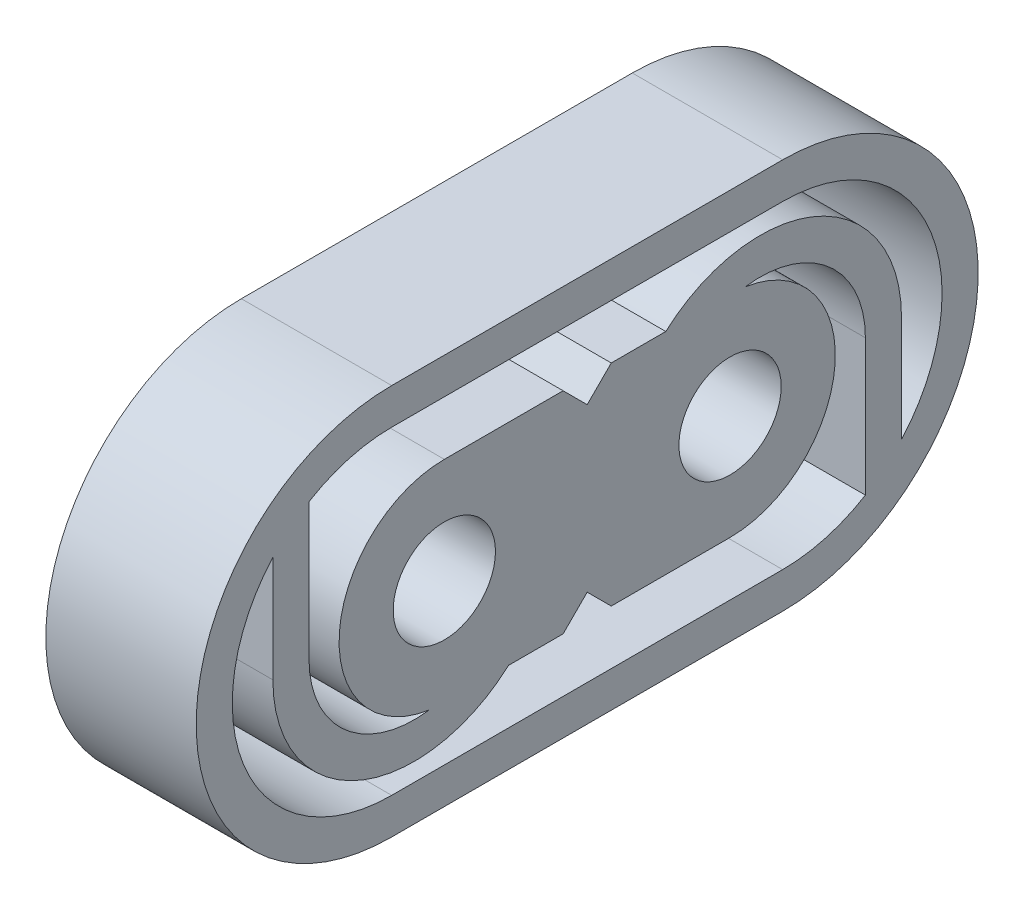
ISO-10303-21;
HEADER;
FILE_DESCRIPTION(('STEP AP214'),'2;1');
FILE_NAME('part.step','',(''),(''),'','','');
FILE_SCHEMA(('AUTOMOTIVE_DESIGN { 1 0 10303 214 1 1 1 1 }'));
ENDSEC;
DATA;
#1=APPLICATION_CONTEXT('core data for automotive mechanical design processes');
#2=APPLICATION_PROTOCOL_DEFINITION('international standard','automotive_design',2000,#1);
#3=PRODUCT_CONTEXT('',#1,'mechanical');
#4=PRODUCT('Part','Part','',(#3));
#5=PRODUCT_RELATED_PRODUCT_CATEGORY('part','',(#4));
#6=PRODUCT_DEFINITION_FORMATION('','',#4);
#7=PRODUCT_DEFINITION_CONTEXT('part definition',#1,'design');
#8=PRODUCT_DEFINITION('design','',#6,#7);
#9=PRODUCT_DEFINITION_SHAPE('','',#8);
#10=(LENGTH_UNIT() NAMED_UNIT(*) SI_UNIT(.MILLI.,.METRE.));
#11=(NAMED_UNIT(*) PLANE_ANGLE_UNIT() SI_UNIT($,.RADIAN.));
#12=(NAMED_UNIT(*) SI_UNIT($,.STERADIAN.) SOLID_ANGLE_UNIT());
#13=UNCERTAINTY_MEASURE_WITH_UNIT(LENGTH_MEASURE(1.E-05),#10,'distance_accuracy_value','');
#14=(GEOMETRIC_REPRESENTATION_CONTEXT(3) GLOBAL_UNCERTAINTY_ASSIGNED_CONTEXT((#13)) GLOBAL_UNIT_ASSIGNED_CONTEXT((#10,
#11,#12)) REPRESENTATION_CONTEXT('',''));
#15=CARTESIAN_POINT('',(0.,0.,0.));
#16=DIRECTION('',(0.,0.,1.));
#17=DIRECTION('',(1.,0.,0.));
#18=AXIS2_PLACEMENT_3D('',#15,#16,#17);
#19=CARTESIAN_POINT('',(5.,0.0278549064895704,6.49624326478912));
#20=DIRECTION('',(1.,0.,0.));
#21=DIRECTION('',(0.,0.,-1.));
#22=AXIS2_PLACEMENT_3D('',#19,#20,#21);
#23=PLANE('',#22);
#24=CARTESIAN_POINT('',(5.,0.0278549064895708,4.74624326478912));
#25=DIRECTION('',(1.,0.,0.));
#26=DIRECTION('',(0.,0.,-1.));
#27=AXIS2_PLACEMENT_3D('',#24,#25,#26);
#28=CIRCLE('',#27,1.7);
#29=CARTESIAN_POINT('',(5.,0.0278549064895708,3.04624326478912));
#30=VERTEX_POINT('',#29);
#31=EDGE_CURVE('E272',#30,#30,#28,.T.);
#32=ORIENTED_EDGE('',*,*,#31,.F.);
#33=EDGE_LOOP('',(#32));
#34=FACE_BOUND('',#33,.T.);
#35=CARTESIAN_POINT('',(5.,0.0278549064895704,6.49624326478912));
#36=DIRECTION('',(1.,0.,0.));
#37=DIRECTION('',(0.,0.,-1.));
#38=AXIS2_PLACEMENT_3D('',#35,#36,#37);
#39=CIRCLE('',#38,6.5);
#40=CARTESIAN_POINT('',(5.,6.52785490648957,6.49624326478912));
#41=VERTEX_POINT('',#40);
#42=CARTESIAN_POINT('',(5.,-6.47214509351043,6.49624326478912));
#43=VERTEX_POINT('',#42);
#44=EDGE_CURVE('E414',#41,#43,#39,.T.);
#45=ORIENTED_EDGE('',*,*,#44,.T.);
#46=DIRECTION('',(0.,0.,-1.));
#47=VECTOR('',#46,1.);
#48=CARTESIAN_POINT('',(5.,-6.47214509351043,6.49624326478912));
#49=LINE('',#48,#47);
#50=CARTESIAN_POINT('',(5.,-6.47214509351043,-6.50375673521088));
#51=VERTEX_POINT('',#50);
#52=EDGE_CURVE('E413',#43,#51,#49,.T.);
#53=ORIENTED_EDGE('',*,*,#52,.T.);
#54=CARTESIAN_POINT('',(5.,0.0278549064895723,-6.50375673521088));
#55=DIRECTION('',(1.,0.,0.));
#56=DIRECTION('',(0.,0.,-1.));
#57=AXIS2_PLACEMENT_3D('',#54,#55,#56);
#58=CIRCLE('',#57,6.5);
#59=CARTESIAN_POINT('',(5.,6.52785490648957,-6.50375673521088));
#60=VERTEX_POINT('',#59);
#61=EDGE_CURVE('E416',#51,#60,#58,.T.);
#62=ORIENTED_EDGE('',*,*,#61,.T.);
#63=DIRECTION('',(0.,0.,1.));
#64=VECTOR('',#63,1.);
#65=CARTESIAN_POINT('',(5.,6.52785490648957,6.49624326478912));
#66=LINE('',#65,#64);
#67=EDGE_CURVE('E419',#60,#41,#66,.T.);
#68=ORIENTED_EDGE('',*,*,#67,.T.);
#69=EDGE_LOOP('',(#45,#53,#62,#68));
#70=FACE_BOUND('',#69,.T.);
#71=DIRECTION('',(0.,0.,-1.));
#72=VECTOR('',#71,1.);
#73=CARTESIAN_POINT('',(5.,-5.27214509351043,6.49624326478912));
#74=LINE('',#73,#72);
#75=CARTESIAN_POINT('',(5.,-5.27214509351043,6.49624326478912));
#76=VERTEX_POINT('',#75);
#77=CARTESIAN_POINT('',(5.,-5.27214509351043,-6.50375673521091));
#78=VERTEX_POINT('',#77);
#79=EDGE_CURVE('E330',#76,#78,#74,.T.);
#80=ORIENTED_EDGE('',*,*,#79,.F.);
#81=CARTESIAN_POINT('',(5.,0.02785490648957,6.49624326478912));
#82=DIRECTION('',(1.,0.,0.));
#83=DIRECTION('',(0.,0.,-1.));
#84=AXIS2_PLACEMENT_3D('',#81,#82,#83);
#85=CIRCLE('',#84,5.3);
#86=CARTESIAN_POINT('',(5.,3.5616206033065,10.4462432647891));
#87=VERTEX_POINT('',#86);
#88=EDGE_CURVE('E324',#87,#76,#85,.T.);
#89=ORIENTED_EDGE('',*,*,#88,.F.);
#90=DIRECTION('',(0.,1.,0.));
#91=VECTOR('',#90,1.);
#92=CARTESIAN_POINT('',(5.,0.0278549064895708,10.4462432647891));
#93=LINE('',#92,#91);
#94=CARTESIAN_POINT('',(5.,0.0278549064895714,10.4462432647891));
#95=VERTEX_POINT('',#94);
#96=EDGE_CURVE('E349',#95,#87,#93,.T.);
#97=ORIENTED_EDGE('',*,*,#96,.F.);
#98=CARTESIAN_POINT('',(5.,0.0278549064895708,5.74624326478912));
#99=DIRECTION('',(-1.,0.,0.));
#100=DIRECTION('',(0.,0.,-1.));
#101=AXIS2_PLACEMENT_3D('',#98,#99,#100);
#102=CIRCLE('',#101,4.7);
#103=CARTESIAN_POINT('',(5.,-3.47214509351043,2.6093658365175));
#104=VERTEX_POINT('',#103);
#105=EDGE_CURVE('E347',#104,#95,#102,.T.);
#106=ORIENTED_EDGE('',*,*,#105,.F.);
#107=DIRECTION('',(0.,0.,1.));
#108=VECTOR('',#107,1.);
#109=CARTESIAN_POINT('',(5.,-3.47214509351043,2.6093658365175));
#110=LINE('',#109,#108);
#111=CARTESIAN_POINT('',(5.,-3.47214509351043,0.796243264789123));
#112=VERTEX_POINT('',#111);
#113=EDGE_CURVE('E341',#112,#104,#110,.T.);
#114=ORIENTED_EDGE('',*,*,#113,.F.);
#115=DIRECTION('',(0.,-0.707106781186547,0.707106781186548));
#116=VECTOR('',#115,1.);
#117=CARTESIAN_POINT('',(5.,-3.47214509351043,0.796243264789123));
#118=LINE('',#117,#116);
#119=CARTESIAN_POINT('',(5.,-2.67214509351043,-0.00375673521087715));
#120=VERTEX_POINT('',#119);
#121=EDGE_CURVE('E344',#120,#112,#118,.T.);
#122=ORIENTED_EDGE('',*,*,#121,.F.);
#123=DIRECTION('',(0.,0.707106781186548,0.707106781186547));
#124=VECTOR('',#123,1.);
#125=CARTESIAN_POINT('',(5.,-2.67214509351043,-0.00375673521087715));
#126=LINE('',#125,#124);
#127=CARTESIAN_POINT('',(5.,-3.47214509351043,-0.803756735210877));
#128=VERTEX_POINT('',#127);
#129=EDGE_CURVE('E339',#128,#120,#126,.T.);
#130=ORIENTED_EDGE('',*,*,#129,.F.);
#131=DIRECTION('',(0.,0.,1.));
#132=VECTOR('',#131,1.);
#133=CARTESIAN_POINT('',(5.,-3.47214509351043,-0.803756735210877));
#134=LINE('',#133,#132);
#135=CARTESIAN_POINT('',(5.,-3.47214509351043,-4.7537567352109));
#136=VERTEX_POINT('',#135);
#137=EDGE_CURVE('E337',#136,#128,#134,.T.);
#138=ORIENTED_EDGE('',*,*,#137,.F.);
#139=CARTESIAN_POINT('',(5.,0.0278549064895708,-4.75375673521088));
#140=DIRECTION('',(-1.,0.,0.));
#141=DIRECTION('',(0.,0.,-1.));
#142=AXIS2_PLACEMENT_3D('',#139,#140,#141);
#143=CIRCLE('',#142,3.5);
#144=CARTESIAN_POINT('',(5.,3.49195652162733,-5.25375673521088));
#145=VERTEX_POINT('',#144);
#146=EDGE_CURVE('E336',#145,#136,#143,.T.);
#147=ORIENTED_EDGE('',*,*,#146,.F.);
#148=CARTESIAN_POINT('',(5.,0.0278549064895708,-5.75375673521088));
#149=DIRECTION('',(1.,0.,0.));
#150=DIRECTION('',(0.,0.,-1.));
#151=AXIS2_PLACEMENT_3D('',#148,#149,#150);
#152=CIRCLE('',#151,3.5);
#153=CARTESIAN_POINT('',(5.,0.0278549064895708,-9.25375673521088));
#154=VERTEX_POINT('',#153);
#155=EDGE_CURVE('E331',#154,#145,#152,.T.);
#156=ORIENTED_EDGE('',*,*,#155,.F.);
#157=DIRECTION('',(0.,1.,0.));
#158=VECTOR('',#157,1.);
#159=CARTESIAN_POINT('',(5.,-4.50287351176726,-9.25375673521088));
#160=LINE('',#159,#158);
#161=CARTESIAN_POINT('',(5.,-4.50287351176726,-9.25375673521087));
#162=VERTEX_POINT('',#161);
#163=EDGE_CURVE('E335',#162,#154,#160,.T.);
#164=ORIENTED_EDGE('',*,*,#163,.F.);
#165=CARTESIAN_POINT('',(5.,0.0278549064895723,-6.50375673521088));
#166=DIRECTION('',(1.,0.,0.));
#167=DIRECTION('',(0.,0.,-1.));
#168=AXIS2_PLACEMENT_3D('',#165,#166,#167);
#169=CIRCLE('',#168,5.3);
#170=EDGE_CURVE('E329',#78,#162,#169,.T.);
#171=ORIENTED_EDGE('',*,*,#170,.F.);
#172=EDGE_LOOP('',(#80,#89,#97,#106,#114,#122,#130,#138,#147,#156,#164,#171));
#173=FACE_BOUND('',#172,.T.);
#174=DIRECTION('',(0.,-1.,0.));
#175=VECTOR('',#174,1.);
#176=CARTESIAN_POINT('',(5.,4.5585833247464,9.24624326478912));
#177=LINE('',#176,#175);
#178=CARTESIAN_POINT('',(5.,4.5585833247464,9.24624326478912));
#179=VERTEX_POINT('',#178);
#180=CARTESIAN_POINT('',(5.,0.0278549064895586,9.24624326478912));
#181=VERTEX_POINT('',#180);
#182=EDGE_CURVE('E233',#179,#181,#177,.T.);
#183=ORIENTED_EDGE('',*,*,#182,.F.);
#184=CARTESIAN_POINT('',(5.,0.02785490648957,6.49624326478912));
#185=DIRECTION('',(1.,0.,0.));
#186=DIRECTION('',(0.,0.,-1.));
#187=AXIS2_PLACEMENT_3D('',#184,#185,#186);
#188=CIRCLE('',#187,5.3);
#189=CARTESIAN_POINT('',(5.,5.32785490648957,6.49624326478912));
#190=VERTEX_POINT('',#189);
#191=EDGE_CURVE('E230',#190,#179,#188,.T.);
#192=ORIENTED_EDGE('',*,*,#191,.F.);
#193=DIRECTION('',(0.,0.,1.));
#194=VECTOR('',#193,1.);
#195=CARTESIAN_POINT('',(5.,5.32785490648957,6.49624326478912));
#196=LINE('',#195,#194);
#197=CARTESIAN_POINT('',(5.,5.32785490648957,-6.50375673521088));
#198=VERTEX_POINT('',#197);
#199=EDGE_CURVE('E269',#198,#190,#196,.T.);
#200=ORIENTED_EDGE('',*,*,#199,.F.);
#201=CARTESIAN_POINT('',(5.,0.0278549064895723,-6.50375673521088));
#202=DIRECTION('',(1.,0.,0.));
#203=DIRECTION('',(0.,0.,-1.));
#204=AXIS2_PLACEMENT_3D('',#201,#202,#203);
#205=CIRCLE('',#204,5.3);
#206=CARTESIAN_POINT('',(5.,-3.50591079032736,-10.4537567352109));
#207=VERTEX_POINT('',#206);
#208=EDGE_CURVE('E268',#207,#198,#205,.T.);
#209=ORIENTED_EDGE('',*,*,#208,.F.);
#210=DIRECTION('',(0.,-1.,0.));
#211=VECTOR('',#210,1.);
#212=CARTESIAN_POINT('',(5.,-3.50591079032736,-10.4537567352109));
#213=LINE('',#212,#211);
#214=CARTESIAN_POINT('',(5.,0.0278549064895708,-10.4537567352109));
#215=VERTEX_POINT('',#214);
#216=EDGE_CURVE('E266',#215,#207,#213,.T.);
#217=ORIENTED_EDGE('',*,*,#216,.F.);
#218=CARTESIAN_POINT('',(5.,0.0278549064895708,-5.75375673521088));
#219=DIRECTION('',(-1.,0.,0.));
#220=DIRECTION('',(0.,0.,-1.));
#221=AXIS2_PLACEMENT_3D('',#218,#219,#220);
#222=CIRCLE('',#221,4.7);
#223=CARTESIAN_POINT('',(5.,3.52785490648957,-2.61687930693925));
#224=VERTEX_POINT('',#223);
#225=EDGE_CURVE('E262',#224,#215,#222,.T.);
#226=ORIENTED_EDGE('',*,*,#225,.F.);
#227=DIRECTION('',(0.,0.,-1.));
#228=VECTOR('',#227,1.);
#229=CARTESIAN_POINT('',(5.,3.52785490648957,-2.61687930693925));
#230=LINE('',#229,#228);
#231=CARTESIAN_POINT('',(5.,3.52785490648957,-0.803756735210877));
#232=VERTEX_POINT('',#231);
#233=EDGE_CURVE('E265',#232,#224,#230,.T.);
#234=ORIENTED_EDGE('',*,*,#233,.F.);
#235=DIRECTION('',(0.,0.707106781186548,-0.707106781186547));
#236=VECTOR('',#235,1.);
#237=CARTESIAN_POINT('',(5.,3.52785490648957,-0.803756735210877));
#238=LINE('',#237,#236);
#239=CARTESIAN_POINT('',(5.,2.72785490648957,-0.00375673521087715));
#240=VERTEX_POINT('',#239);
#241=EDGE_CURVE('E257',#240,#232,#238,.T.);
#242=ORIENTED_EDGE('',*,*,#241,.F.);
#243=DIRECTION('',(0.,-0.707106781186547,-0.707106781186548));
#244=VECTOR('',#243,1.);
#245=CARTESIAN_POINT('',(5.,2.72785490648957,-0.00375673521087715));
#246=LINE('',#245,#244);
#247=CARTESIAN_POINT('',(5.,3.52785490648957,0.796243264789123));
#248=VERTEX_POINT('',#247);
#249=EDGE_CURVE('E256',#248,#240,#246,.T.);
#250=ORIENTED_EDGE('',*,*,#249,.F.);
#251=DIRECTION('',(0.,0.,-1.));
#252=VECTOR('',#251,1.);
#253=CARTESIAN_POINT('',(5.,3.52785490648957,0.796243264789123));
#254=LINE('',#253,#252);
#255=CARTESIAN_POINT('',(5.,3.52785490648957,4.74624326478912));
#256=VERTEX_POINT('',#255);
#257=EDGE_CURVE('E258',#256,#248,#254,.T.);
#258=ORIENTED_EDGE('',*,*,#257,.F.);
#259=CARTESIAN_POINT('',(5.,0.0278549064895708,4.74624326478912));
#260=DIRECTION('',(-1.,0.,0.));
#261=DIRECTION('',(0.,0.,-1.));
#262=AXIS2_PLACEMENT_3D('',#259,#260,#261);
#263=CIRCLE('',#262,3.5);
#264=CARTESIAN_POINT('',(5.,-3.43624670864818,5.24624326478913));
#265=VERTEX_POINT('',#264);
#266=EDGE_CURVE('E253',#265,#256,#263,.T.);
#267=ORIENTED_EDGE('',*,*,#266,.F.);
#268=CARTESIAN_POINT('',(5.,0.0278549064895708,5.74624326478912));
#269=DIRECTION('',(1.,0.,0.));
#270=DIRECTION('',(0.,0.,-1.));
#271=AXIS2_PLACEMENT_3D('',#268,#269,#270);
#272=CIRCLE('',#271,3.5);
#273=EDGE_CURVE('E246',#181,#265,#272,.T.);
#274=ORIENTED_EDGE('',*,*,#273,.F.);
#275=EDGE_LOOP('',(#183,#192,#200,#209,#217,#226,#234,#242,#250,#258,#267,#274));
#276=FACE_BOUND('',#275,.T.);
#277=CARTESIAN_POINT('',(5.,0.0278549064895708,-4.75375673521088));
#278=DIRECTION('',(1.,0.,0.));
#279=DIRECTION('',(0.,0.,-1.));
#280=AXIS2_PLACEMENT_3D('',#277,#278,#279);
#281=CIRCLE('',#280,1.7);
#282=CARTESIAN_POINT('',(5.,0.0278549064895708,-6.45375673521088));
#283=VERTEX_POINT('',#282);
#284=EDGE_CURVE('E591',#283,#283,#281,.T.);
#285=ORIENTED_EDGE('',*,*,#284,.F.);
#286=EDGE_LOOP('',(#285));
#287=FACE_BOUND('',#286,.T.);
#288=ADVANCED_FACE('F41',(#34,#70,#173,#276,#287),#23,.T.);
#289=CARTESIAN_POINT('',(0.,0.0278549064895704,6.49624326478912));
#290=DIRECTION('',(1.,0.,0.));
#291=DIRECTION('',(0.,0.,-1.));
#292=AXIS2_PLACEMENT_3D('',#289,#290,#291);
#293=PLANE('',#292);
#294=CARTESIAN_POINT('',(0.,0.0278549064895708,-5.75375673521088));
#295=DIRECTION('',(1.,0.,0.));
#296=DIRECTION('',(0.,0.,-1.));
#297=AXIS2_PLACEMENT_3D('',#294,#295,#296);
#298=CIRCLE('',#297,3.5);
#299=CARTESIAN_POINT('',(0.,0.0278549064895708,-9.25375673521088));
#300=VERTEX_POINT('',#299);
#301=CARTESIAN_POINT('',(0.,3.49195652162733,-5.25375673521088));
#302=VERTEX_POINT('',#301);
#303=EDGE_CURVE('E361',#300,#302,#298,.T.);
#304=ORIENTED_EDGE('',*,*,#303,.T.);
#305=CARTESIAN_POINT('',(0.,0.0278549064895708,-4.75375673521088));
#306=DIRECTION('',(1.,0.,0.));
#307=DIRECTION('',(0.,0.,-1.));
#308=AXIS2_PLACEMENT_3D('',#305,#306,#307);
#309=CIRCLE('',#308,3.5);
#310=CARTESIAN_POINT('',(0.,-3.47214509351043,-4.7537567352109));
#311=VERTEX_POINT('',#310);
#312=EDGE_CURVE('E444',#302,#311,#309,.T.);
#313=ORIENTED_EDGE('',*,*,#312,.T.);
#314=DIRECTION('',(0.,0.,1.));
#315=VECTOR('',#314,1.);
#316=CARTESIAN_POINT('',(0.,-3.47214509351043,-0.803756735210877));
#317=LINE('',#316,#315);
#318=CARTESIAN_POINT('',(0.,-3.47214509351043,-0.803756735210877));
#319=VERTEX_POINT('',#318);
#320=EDGE_CURVE('E366',#311,#319,#317,.T.);
#321=ORIENTED_EDGE('',*,*,#320,.T.);
#322=DIRECTION('',(0.,0.707106781186548,0.707106781186547));
#323=VECTOR('',#322,1.);
#324=CARTESIAN_POINT('',(0.,-2.67214509351043,-0.00375673521087715));
#325=LINE('',#324,#323);
#326=CARTESIAN_POINT('',(0.,-2.67214509351043,-0.00375673521087715));
#327=VERTEX_POINT('',#326);
#328=EDGE_CURVE('E371',#319,#327,#325,.T.);
#329=ORIENTED_EDGE('',*,*,#328,.T.);
#330=DIRECTION('',(0.,-0.707106781186547,0.707106781186548));
#331=VECTOR('',#330,1.);
#332=CARTESIAN_POINT('',(0.,-3.47214509351043,0.796243264789123));
#333=LINE('',#332,#331);
#334=CARTESIAN_POINT('',(0.,-3.47214509351043,0.796243264789123));
#335=VERTEX_POINT('',#334);
#336=EDGE_CURVE('E372',#327,#335,#333,.T.);
#337=ORIENTED_EDGE('',*,*,#336,.T.);
#338=DIRECTION('',(0.,0.,1.));
#339=VECTOR('',#338,1.);
#340=CARTESIAN_POINT('',(0.,-3.47214509351043,2.6093658365175));
#341=LINE('',#340,#339);
#342=CARTESIAN_POINT('',(0.,-3.47214509351043,2.6093658365175));
#343=VERTEX_POINT('',#342);
#344=EDGE_CURVE('E380',#335,#343,#341,.T.);
#345=ORIENTED_EDGE('',*,*,#344,.T.);
#346=CARTESIAN_POINT('',(0.,0.0278549064895708,5.74624326478912));
#347=DIRECTION('',(-1.,0.,0.));
#348=DIRECTION('',(0.,0.,-1.));
#349=AXIS2_PLACEMENT_3D('',#346,#347,#348);
#350=CIRCLE('',#349,4.7);
#351=CARTESIAN_POINT('',(0.,0.0278549064895714,10.4462432647891));
#352=VERTEX_POINT('',#351);
#353=EDGE_CURVE('E379',#343,#352,#350,.T.);
#354=ORIENTED_EDGE('',*,*,#353,.T.);
#355=DIRECTION('',(0.,1.,0.));
#356=VECTOR('',#355,1.);
#357=CARTESIAN_POINT('',(0.,0.0278549064895708,10.4462432647891));
#358=LINE('',#357,#356);
#359=CARTESIAN_POINT('',(0.,3.5616206033065,10.4462432647891));
#360=VERTEX_POINT('',#359);
#361=EDGE_CURVE('E327',#352,#360,#358,.T.);
#362=ORIENTED_EDGE('',*,*,#361,.T.);
#363=CARTESIAN_POINT('',(0.,0.02785490648957,6.49624326478912));
#364=DIRECTION('',(1.,0.,0.));
#365=DIRECTION('',(0.,0.,-1.));
#366=AXIS2_PLACEMENT_3D('',#363,#364,#365);
#367=CIRCLE('',#366,5.3);
#368=CARTESIAN_POINT('',(0.,-5.27214509351043,6.49624326478912));
#369=VERTEX_POINT('',#368);
#370=EDGE_CURVE('E242',#360,#369,#367,.T.);
#371=ORIENTED_EDGE('',*,*,#370,.T.);
#372=DIRECTION('',(0.,0.,-1.));
#373=VECTOR('',#372,1.);
#374=CARTESIAN_POINT('',(0.,-5.27214509351043,6.49624326478912));
#375=LINE('',#374,#373);
#376=CARTESIAN_POINT('',(0.,-5.27214509351043,-6.50375673521091));
#377=VERTEX_POINT('',#376);
#378=EDGE_CURVE('E353',#369,#377,#375,.T.);
#379=ORIENTED_EDGE('',*,*,#378,.T.);
#380=CARTESIAN_POINT('',(0.,0.0278549064895723,-6.50375673521088));
#381=DIRECTION('',(1.,0.,0.));
#382=DIRECTION('',(0.,0.,-1.));
#383=AXIS2_PLACEMENT_3D('',#380,#381,#382);
#384=CIRCLE('',#383,5.3);
#385=CARTESIAN_POINT('',(0.,-4.50287351176726,-9.25375673521087));
#386=VERTEX_POINT('',#385);
#387=EDGE_CURVE('E359',#377,#386,#384,.T.);
#388=ORIENTED_EDGE('',*,*,#387,.T.);
#389=DIRECTION('',(0.,1.,0.));
#390=VECTOR('',#389,1.);
#391=CARTESIAN_POINT('',(0.,-4.50287351176726,-9.25375673521088));
#392=LINE('',#391,#390);
#393=EDGE_CURVE('E358',#386,#300,#392,.T.);
#394=ORIENTED_EDGE('',*,*,#393,.T.);
#395=EDGE_LOOP('',(#304,#313,#321,#329,#337,#345,#354,#362,#371,#379,#388,#394));
#396=FACE_BOUND('',#395,.T.);
#397=CARTESIAN_POINT('',(0.,0.0278549064895704,6.49624326478912));
#398=DIRECTION('',(1.,0.,0.));
#399=DIRECTION('',(0.,0.,-1.));
#400=AXIS2_PLACEMENT_3D('',#397,#398,#399);
#401=CIRCLE('',#400,6.5);
#402=CARTESIAN_POINT('',(0.,6.52785490648957,6.49624326478912));
#403=VERTEX_POINT('',#402);
#404=CARTESIAN_POINT('',(0.,-6.47214509351043,6.49624326478912));
#405=VERTEX_POINT('',#404);
#406=EDGE_CURVE('E412',#403,#405,#401,.T.);
#407=ORIENTED_EDGE('',*,*,#406,.F.);
#408=DIRECTION('',(0.,0.,1.));
#409=VECTOR('',#408,1.);
#410=CARTESIAN_POINT('',(0.,6.52785490648957,6.49624326478912));
#411=LINE('',#410,#409);
#412=CARTESIAN_POINT('',(0.,6.52785490648957,-6.50375673521088));
#413=VERTEX_POINT('',#412);
#414=EDGE_CURVE('E418',#413,#403,#411,.T.);
#415=ORIENTED_EDGE('',*,*,#414,.F.);
#416=CARTESIAN_POINT('',(0.,0.0278549064895723,-6.50375673521088));
#417=DIRECTION('',(1.,0.,0.));
#418=DIRECTION('',(0.,0.,-1.));
#419=AXIS2_PLACEMENT_3D('',#416,#417,#418);
#420=CIRCLE('',#419,6.5);
#421=CARTESIAN_POINT('',(0.,-6.47214509351043,-6.50375673521088));
#422=VERTEX_POINT('',#421);
#423=EDGE_CURVE('E430',#422,#413,#420,.T.);
#424=ORIENTED_EDGE('',*,*,#423,.F.);
#425=DIRECTION('',(0.,0.,-1.));
#426=VECTOR('',#425,1.);
#427=CARTESIAN_POINT('',(0.,-6.47214509351043,6.49624326478912));
#428=LINE('',#427,#426);
#429=EDGE_CURVE('E422',#405,#422,#428,.T.);
#430=ORIENTED_EDGE('',*,*,#429,.F.);
#431=EDGE_LOOP('',(#407,#415,#424,#430));
#432=FACE_BOUND('',#431,.T.);
#433=CARTESIAN_POINT('',(0.,0.0278549064895708,5.74624326478912));
#434=DIRECTION('',(1.,0.,0.));
#435=DIRECTION('',(0.,0.,-1.));
#436=AXIS2_PLACEMENT_3D('',#433,#434,#435);
#437=CIRCLE('',#436,3.5);
#438=CARTESIAN_POINT('',(0.,0.0278549064895586,9.24624326478912));
#439=VERTEX_POINT('',#438);
#440=CARTESIAN_POINT('',(0.,-3.43624670864818,5.24624326478913));
#441=VERTEX_POINT('',#440);
#442=EDGE_CURVE('E274',#439,#441,#437,.T.);
#443=ORIENTED_EDGE('',*,*,#442,.T.);
#444=CARTESIAN_POINT('',(0.,0.0278549064895708,4.74624326478912));
#445=DIRECTION('',(1.,0.,0.));
#446=DIRECTION('',(0.,0.,-1.));
#447=AXIS2_PLACEMENT_3D('',#444,#445,#446);
#448=CIRCLE('',#447,3.5);
#449=CARTESIAN_POINT('',(0.,3.52785490648957,4.74624326478912));
#450=VERTEX_POINT('',#449);
#451=EDGE_CURVE('E442',#441,#450,#448,.T.);
#452=ORIENTED_EDGE('',*,*,#451,.T.);
#453=DIRECTION('',(0.,0.,-1.));
#454=VECTOR('',#453,1.);
#455=CARTESIAN_POINT('',(0.,3.52785490648957,0.796243264789123));
#456=LINE('',#455,#454);
#457=CARTESIAN_POINT('',(0.,3.52785490648957,0.796243264789123));
#458=VERTEX_POINT('',#457);
#459=EDGE_CURVE('E281',#450,#458,#456,.T.);
#460=ORIENTED_EDGE('',*,*,#459,.T.);
#461=DIRECTION('',(0.,-0.707106781186547,-0.707106781186548));
#462=VECTOR('',#461,1.);
#463=CARTESIAN_POINT('',(0.,2.72785490648957,-0.00375673521087715));
#464=LINE('',#463,#462);
#465=CARTESIAN_POINT('',(0.,2.72785490648957,-0.00375673521087715));
#466=VERTEX_POINT('',#465);
#467=EDGE_CURVE('E283',#458,#466,#464,.T.);
#468=ORIENTED_EDGE('',*,*,#467,.T.);
#469=DIRECTION('',(0.,0.707106781186548,-0.707106781186547));
#470=VECTOR('',#469,1.);
#471=CARTESIAN_POINT('',(0.,3.52785490648957,-0.803756735210877));
#472=LINE('',#471,#470);
#473=CARTESIAN_POINT('',(0.,3.52785490648957,-0.803756735210877));
#474=VERTEX_POINT('',#473);
#475=EDGE_CURVE('E289',#466,#474,#472,.T.);
#476=ORIENTED_EDGE('',*,*,#475,.T.);
#477=DIRECTION('',(0.,0.,-1.));
#478=VECTOR('',#477,1.);
#479=CARTESIAN_POINT('',(0.,3.52785490648957,-2.61687930693925));
#480=LINE('',#479,#478);
#481=CARTESIAN_POINT('',(0.,3.52785490648957,-2.61687930693925));
#482=VERTEX_POINT('',#481);
#483=EDGE_CURVE('E288',#474,#482,#480,.T.);
#484=ORIENTED_EDGE('',*,*,#483,.T.);
#485=CARTESIAN_POINT('',(0.,0.0278549064895708,-5.75375673521088));
#486=DIRECTION('',(-1.,0.,0.));
#487=DIRECTION('',(0.,0.,-1.));
#488=AXIS2_PLACEMENT_3D('',#485,#486,#487);
#489=CIRCLE('',#488,4.7);
#490=CARTESIAN_POINT('',(0.,0.0278549064895708,-10.4537567352109));
#491=VERTEX_POINT('',#490);
#492=EDGE_CURVE('E291',#482,#491,#489,.T.);
#493=ORIENTED_EDGE('',*,*,#492,.T.);
#494=DIRECTION('',(0.,-1.,0.));
#495=VECTOR('',#494,1.);
#496=CARTESIAN_POINT('',(0.,-3.50591079032736,-10.4537567352109));
#497=LINE('',#496,#495);
#498=CARTESIAN_POINT('',(0.,-3.50591079032736,-10.4537567352109));
#499=VERTEX_POINT('',#498);
#500=EDGE_CURVE('E296',#491,#499,#497,.T.);
#501=ORIENTED_EDGE('',*,*,#500,.T.);
#502=CARTESIAN_POINT('',(0.,0.0278549064895723,-6.50375673521088));
#503=DIRECTION('',(1.,0.,0.));
#504=DIRECTION('',(0.,0.,-1.));
#505=AXIS2_PLACEMENT_3D('',#502,#503,#504);
#506=CIRCLE('',#505,5.3);
#507=CARTESIAN_POINT('',(0.,5.32785490648958,-6.50375673521088));
#508=VERTEX_POINT('',#507);
#509=EDGE_CURVE('E298',#499,#508,#506,.T.);
#510=ORIENTED_EDGE('',*,*,#509,.T.);
#511=DIRECTION('',(0.,0.,1.));
#512=VECTOR('',#511,1.);
#513=CARTESIAN_POINT('',(0.,5.32785490648957,6.49624326478912));
#514=LINE('',#513,#512);
#515=CARTESIAN_POINT('',(0.,5.32785490648957,6.49624326478912));
#516=VERTEX_POINT('',#515);
#517=EDGE_CURVE('E237',#508,#516,#514,.T.);
#518=ORIENTED_EDGE('',*,*,#517,.T.);
#519=CARTESIAN_POINT('',(0.,0.02785490648957,6.49624326478912));
#520=DIRECTION('',(1.,0.,0.));
#521=DIRECTION('',(0.,0.,-1.));
#522=AXIS2_PLACEMENT_3D('',#519,#520,#521);
#523=CIRCLE('',#522,5.3);
#524=CARTESIAN_POINT('',(0.,4.5585833247464,9.24624326478912));
#525=VERTEX_POINT('',#524);
#526=EDGE_CURVE('E64',#516,#525,#523,.T.);
#527=ORIENTED_EDGE('',*,*,#526,.T.);
#528=DIRECTION('',(0.,-1.,0.));
#529=VECTOR('',#528,1.);
#530=CARTESIAN_POINT('',(0.,4.5585833247464,9.24624326478912));
#531=LINE('',#530,#529);
#532=EDGE_CURVE('E245',#525,#439,#531,.T.);
#533=ORIENTED_EDGE('',*,*,#532,.T.);
#534=EDGE_LOOP('',(#443,#452,#460,#468,#476,#484,#493,#501,#510,#518,#527,#533));
#535=FACE_BOUND('',#534,.T.);
#536=ADVANCED_FACE('F459',(#396,#432,#535),#293,.F.);
#537=CARTESIAN_POINT('',(5.,0.0278549064895704,6.49624326478912));
#538=DIRECTION('',(-1.,0.,0.));
#539=DIRECTION('',(0.,0.,1.));
#540=AXIS2_PLACEMENT_3D('',#537,#538,#539);
#541=CYLINDRICAL_SURFACE('',#540,6.5);
#542=ORIENTED_EDGE('',*,*,#406,.T.);
#543=DIRECTION('',(-1.,0.,0.));
#544=VECTOR('',#543,1.);
#545=CARTESIAN_POINT('',(5.,-6.47214509351043,6.49624326478912));
#546=LINE('',#545,#544);
#547=EDGE_CURVE('E437',#43,#405,#546,.T.);
#548=ORIENTED_EDGE('',*,*,#547,.F.);
#549=ORIENTED_EDGE('',*,*,#44,.F.);
#550=DIRECTION('',(-1.,0.,0.));
#551=VECTOR('',#550,1.);
#552=CARTESIAN_POINT('',(5.,6.52785490648957,6.49624326478912));
#553=LINE('',#552,#551);
#554=EDGE_CURVE('E425',#41,#403,#553,.T.);
#555=ORIENTED_EDGE('',*,*,#554,.T.);
#556=EDGE_LOOP('',(#542,#548,#549,#555));
#557=FACE_BOUND('',#556,.T.);
#558=ADVANCED_FACE('F533',(#557),#541,.T.);
#559=CARTESIAN_POINT('',(5.,-6.47214509351043,6.49624326478912));
#560=DIRECTION('',(0.,1.,0.));
#561=DIRECTION('',(0.,0.,1.));
#562=AXIS2_PLACEMENT_3D('',#559,#560,#561);
#563=PLANE('',#562);
#564=ORIENTED_EDGE('',*,*,#429,.T.);
#565=DIRECTION('',(-1.,0.,0.));
#566=VECTOR('',#565,1.);
#567=CARTESIAN_POINT('',(5.,-6.47214509351043,-6.50375673521088));
#568=LINE('',#567,#566);
#569=EDGE_CURVE('E434',#51,#422,#568,.T.);
#570=ORIENTED_EDGE('',*,*,#569,.F.);
#571=ORIENTED_EDGE('',*,*,#52,.F.);
#572=ORIENTED_EDGE('',*,*,#547,.T.);
#573=EDGE_LOOP('',(#564,#570,#571,#572));
#574=FACE_BOUND('',#573,.T.);
#575=ADVANCED_FACE('F544',(#574),#563,.F.);
#576=CARTESIAN_POINT('',(5.,0.0278549064895723,-6.50375673521088));
#577=DIRECTION('',(-1.,0.,0.));
#578=DIRECTION('',(0.,0.,1.));
#579=AXIS2_PLACEMENT_3D('',#576,#577,#578);
#580=CYLINDRICAL_SURFACE('',#579,6.5);
#581=ORIENTED_EDGE('',*,*,#423,.T.);
#582=DIRECTION('',(-1.,0.,0.));
#583=VECTOR('',#582,1.);
#584=CARTESIAN_POINT('',(5.,6.52785490648957,-6.50375673521088));
#585=LINE('',#584,#583);
#586=EDGE_CURVE('E435',#60,#413,#585,.T.);
#587=ORIENTED_EDGE('',*,*,#586,.F.);
#588=ORIENTED_EDGE('',*,*,#61,.F.);
#589=ORIENTED_EDGE('',*,*,#569,.T.);
#590=EDGE_LOOP('',(#581,#587,#588,#589));
#591=FACE_BOUND('',#590,.T.);
#592=ADVANCED_FACE('F541',(#591),#580,.T.);
#593=CARTESIAN_POINT('',(5.,6.52785490648957,6.49624326478912));
#594=DIRECTION('',(0.,-1.,0.));
#595=DIRECTION('',(0.,0.,-1.));
#596=AXIS2_PLACEMENT_3D('',#593,#594,#595);
#597=PLANE('',#596);
#598=ORIENTED_EDGE('',*,*,#414,.T.);
#599=ORIENTED_EDGE('',*,*,#554,.F.);
#600=ORIENTED_EDGE('',*,*,#67,.F.);
#601=ORIENTED_EDGE('',*,*,#586,.T.);
#602=EDGE_LOOP('',(#598,#599,#600,#601));
#603=FACE_BOUND('',#602,.T.);
#604=ADVANCED_FACE('F538',(#603),#597,.F.);
#605=CARTESIAN_POINT('',(5.,0.02785490648957,6.49624326478912));
#606=DIRECTION('',(-1.,0.,0.));
#607=DIRECTION('',(0.,0.,1.));
#608=AXIS2_PLACEMENT_3D('',#605,#606,#607);
#609=CYLINDRICAL_SURFACE('',#608,5.3);
#610=ORIENTED_EDGE('',*,*,#370,.F.);
#611=DIRECTION('',(-1.,0.,0.));
#612=VECTOR('',#611,1.);
#613=CARTESIAN_POINT('',(5.,3.5616206033065,10.4462432647891));
#614=LINE('',#613,#612);
#615=EDGE_CURVE('E351',#87,#360,#614,.T.);
#616=ORIENTED_EDGE('',*,*,#615,.F.);
#617=ORIENTED_EDGE('',*,*,#88,.T.);
#618=DIRECTION('',(-1.,0.,0.));
#619=VECTOR('',#618,1.);
#620=CARTESIAN_POINT('',(5.,-5.27214509351043,6.49624326478912));
#621=LINE('',#620,#619);
#622=EDGE_CURVE('E407',#76,#369,#621,.T.);
#623=ORIENTED_EDGE('',*,*,#622,.T.);
#624=EDGE_LOOP('',(#610,#616,#617,#623));
#625=FACE_BOUND('',#624,.T.);
#626=ADVANCED_FACE('F497',(#625),#609,.F.);
#627=CARTESIAN_POINT('',(5.,-5.27214509351043,6.49624326478912));
#628=DIRECTION('',(0.,1.,0.));
#629=DIRECTION('',(0.,0.,1.));
#630=AXIS2_PLACEMENT_3D('',#627,#628,#629);
#631=PLANE('',#630);
#632=ORIENTED_EDGE('',*,*,#378,.F.);
#633=ORIENTED_EDGE('',*,*,#622,.F.);
#634=ORIENTED_EDGE('',*,*,#79,.T.);
#635=DIRECTION('',(-1.,0.,0.));
#636=VECTOR('',#635,1.);
#637=CARTESIAN_POINT('',(5.,-5.27214509351043,-6.50375673521091));
#638=LINE('',#637,#636);
#639=EDGE_CURVE('E406',#78,#377,#638,.T.);
#640=ORIENTED_EDGE('',*,*,#639,.T.);
#641=EDGE_LOOP('',(#632,#633,#634,#640));
#642=FACE_BOUND('',#641,.T.);
#643=ADVANCED_FACE('F503',(#642),#631,.T.);
#644=CARTESIAN_POINT('',(5.,0.0278549064895723,-6.50375673521088));
#645=DIRECTION('',(-1.,0.,0.));
#646=DIRECTION('',(0.,0.,1.));
#647=AXIS2_PLACEMENT_3D('',#644,#645,#646);
#648=CYLINDRICAL_SURFACE('',#647,5.3);
#649=ORIENTED_EDGE('',*,*,#387,.F.);
#650=ORIENTED_EDGE('',*,*,#639,.F.);
#651=ORIENTED_EDGE('',*,*,#170,.T.);
#652=DIRECTION('',(-1.,0.,0.));
#653=VECTOR('',#652,1.);
#654=CARTESIAN_POINT('',(5.,-4.50287351176726,-9.25375673521087));
#655=LINE('',#654,#653);
#656=EDGE_CURVE('E404',#162,#386,#655,.T.);
#657=ORIENTED_EDGE('',*,*,#656,.T.);
#658=EDGE_LOOP('',(#649,#650,#651,#657));
#659=FACE_BOUND('',#658,.T.);
#660=ADVANCED_FACE('F509',(#659),#648,.F.);
#661=CARTESIAN_POINT('',(5.,-4.50287351176726,-9.25375673521088));
#662=DIRECTION('',(0.,0.,1.));
#663=DIRECTION('',(1.,0.,0.));
#664=AXIS2_PLACEMENT_3D('',#661,#662,#663);
#665=PLANE('',#664);
#666=ORIENTED_EDGE('',*,*,#393,.F.);
#667=ORIENTED_EDGE('',*,*,#656,.F.);
#668=ORIENTED_EDGE('',*,*,#163,.T.);
#669=DIRECTION('',(-1.,0.,0.));
#670=VECTOR('',#669,1.);
#671=CARTESIAN_POINT('',(5.,0.0278549064895708,-9.25375673521088));
#672=LINE('',#671,#670);
#673=EDGE_CURVE('E405',#154,#300,#672,.T.);
#674=ORIENTED_EDGE('',*,*,#673,.T.);
#675=EDGE_LOOP('',(#666,#667,#668,#674));
#676=FACE_BOUND('',#675,.T.);
#677=ADVANCED_FACE('F512',(#676),#665,.T.);
#678=CARTESIAN_POINT('',(5.,0.0278549064895708,-5.75375673521088));
#679=DIRECTION('',(-1.,0.,0.));
#680=DIRECTION('',(0.,0.,1.));
#681=AXIS2_PLACEMENT_3D('',#678,#679,#680);
#682=CYLINDRICAL_SURFACE('',#681,3.5);
#683=ORIENTED_EDGE('',*,*,#303,.F.);
#684=ORIENTED_EDGE('',*,*,#673,.F.);
#685=ORIENTED_EDGE('',*,*,#155,.T.);
#686=DIRECTION('',(-1.,0.,0.));
#687=VECTOR('',#686,1.);
#688=CARTESIAN_POINT('',(5.,3.49195652162733,-5.25375673521088));
#689=LINE('',#688,#687);
#690=EDGE_CURVE('E398',#145,#302,#689,.T.);
#691=ORIENTED_EDGE('',*,*,#690,.T.);
#692=EDGE_LOOP('',(#683,#684,#685,#691));
#693=FACE_BOUND('',#692,.T.);
#694=ADVANCED_FACE('F513',(#693),#682,.F.);
#695=CARTESIAN_POINT('',(5.,0.0278549064895708,-4.75375673521088));
#696=DIRECTION('',(-1.,0.,0.));
#697=DIRECTION('',(0.,0.,1.));
#698=AXIS2_PLACEMENT_3D('',#695,#696,#697);
#699=CYLINDRICAL_SURFACE('',#698,3.5);
#700=CARTESIAN_POINT('',(0.,0.0278549064895708,-4.75375673521088));
#701=DIRECTION('',(-1.,0.,0.));
#702=DIRECTION('',(0.,0.,-1.));
#703=AXIS2_PLACEMENT_3D('',#700,#701,#702);
#704=CIRCLE('',#703,3.5);
#705=EDGE_CURVE('E368',#302,#311,#704,.T.);
#706=ORIENTED_EDGE('',*,*,#705,.F.);
#707=ORIENTED_EDGE('',*,*,#690,.F.);
#708=ORIENTED_EDGE('',*,*,#146,.T.);
#709=DIRECTION('',(-1.,0.,0.));
#710=VECTOR('',#709,1.);
#711=CARTESIAN_POINT('',(5.,-3.47214509351043,-4.7537567352109));
#712=LINE('',#711,#710);
#713=EDGE_CURVE('E399',#136,#311,#712,.T.);
#714=ORIENTED_EDGE('',*,*,#713,.T.);
#715=EDGE_LOOP('',(#706,#707,#708,#714));
#716=FACE_BOUND('',#715,.T.);
#717=ADVANCED_FACE('F463',(#716),#699,.T.);
#718=CARTESIAN_POINT('',(5.,-3.47214509351043,-0.803756735210877));
#719=DIRECTION('',(0.,-1.,0.));
#720=DIRECTION('',(0.,0.,-1.));
#721=AXIS2_PLACEMENT_3D('',#718,#719,#720);
#722=PLANE('',#721);
#723=ORIENTED_EDGE('',*,*,#320,.F.);
#724=ORIENTED_EDGE('',*,*,#713,.F.);
#725=ORIENTED_EDGE('',*,*,#137,.T.);
#726=DIRECTION('',(-1.,0.,0.));
#727=VECTOR('',#726,1.);
#728=CARTESIAN_POINT('',(5.,-3.47214509351043,-0.803756735210877));
#729=LINE('',#728,#727);
#730=EDGE_CURVE('E394',#128,#319,#729,.T.);
#731=ORIENTED_EDGE('',*,*,#730,.T.);
#732=EDGE_LOOP('',(#723,#724,#725,#731));
#733=FACE_BOUND('',#732,.T.);
#734=ADVANCED_FACE('F470',(#733),#722,.T.);
#735=CARTESIAN_POINT('',(5.,-2.67214509351043,-0.00375673521087715));
#736=DIRECTION('',(0.,-0.707106781186547,0.707106781186548));
#737=DIRECTION('',(0.,-0.707106781186548,-0.707106781186547));
#738=AXIS2_PLACEMENT_3D('',#735,#736,#737);
#739=PLANE('',#738);
#740=ORIENTED_EDGE('',*,*,#328,.F.);
#741=ORIENTED_EDGE('',*,*,#730,.F.);
#742=ORIENTED_EDGE('',*,*,#129,.T.);
#743=DIRECTION('',(-1.,0.,0.));
#744=VECTOR('',#743,1.);
#745=CARTESIAN_POINT('',(5.,-2.67214509351043,-0.00375673521087715));
#746=LINE('',#745,#744);
#747=EDGE_CURVE('E392',#120,#327,#746,.T.);
#748=ORIENTED_EDGE('',*,*,#747,.T.);
#749=EDGE_LOOP('',(#740,#741,#742,#748));
#750=FACE_BOUND('',#749,.T.);
#751=ADVANCED_FACE('F471',(#750),#739,.T.);
#752=CARTESIAN_POINT('',(5.,-3.47214509351043,0.796243264789123));
#753=DIRECTION('',(0.,-0.707106781186548,-0.707106781186547));
#754=DIRECTION('',(0.,0.707106781186547,-0.707106781186548));
#755=AXIS2_PLACEMENT_3D('',#752,#753,#754);
#756=PLANE('',#755);
#757=ORIENTED_EDGE('',*,*,#336,.F.);
#758=ORIENTED_EDGE('',*,*,#747,.F.);
#759=ORIENTED_EDGE('',*,*,#121,.T.);
#760=DIRECTION('',(-1.,0.,0.));
#761=VECTOR('',#760,1.);
#762=CARTESIAN_POINT('',(5.,-3.47214509351043,0.796243264789123));
#763=LINE('',#762,#761);
#764=EDGE_CURVE('E391',#112,#335,#763,.T.);
#765=ORIENTED_EDGE('',*,*,#764,.T.);
#766=EDGE_LOOP('',(#757,#758,#759,#765));
#767=FACE_BOUND('',#766,.T.);
#768=ADVANCED_FACE('F476',(#767),#756,.T.);
#769=CARTESIAN_POINT('',(5.,-3.47214509351043,2.6093658365175));
#770=DIRECTION('',(0.,-1.,0.));
#771=DIRECTION('',(0.,0.,-1.));
#772=AXIS2_PLACEMENT_3D('',#769,#770,#771);
#773=PLANE('',#772);
#774=ORIENTED_EDGE('',*,*,#344,.F.);
#775=ORIENTED_EDGE('',*,*,#764,.F.);
#776=ORIENTED_EDGE('',*,*,#113,.T.);
#777=DIRECTION('',(-1.,0.,0.));
#778=VECTOR('',#777,1.);
#779=CARTESIAN_POINT('',(5.,-3.47214509351043,2.6093658365175));
#780=LINE('',#779,#778);
#781=EDGE_CURVE('E386',#104,#343,#780,.T.);
#782=ORIENTED_EDGE('',*,*,#781,.T.);
#783=EDGE_LOOP('',(#774,#775,#776,#782));
#784=FACE_BOUND('',#783,.T.);
#785=ADVANCED_FACE('F483',(#784),#773,.T.);
#786=CARTESIAN_POINT('',(5.,0.0278549064895708,5.74624326478912));
#787=DIRECTION('',(-1.,0.,0.));
#788=DIRECTION('',(0.,0.,1.));
#789=AXIS2_PLACEMENT_3D('',#786,#787,#788);
#790=CYLINDRICAL_SURFACE('',#789,4.7);
#791=ORIENTED_EDGE('',*,*,#353,.F.);
#792=ORIENTED_EDGE('',*,*,#781,.F.);
#793=ORIENTED_EDGE('',*,*,#105,.T.);
#794=DIRECTION('',(-1.,0.,0.));
#795=VECTOR('',#794,1.);
#796=CARTESIAN_POINT('',(5.,0.0278549064895714,10.4462432647891));
#797=LINE('',#796,#795);
#798=EDGE_CURVE('E390',#95,#352,#797,.T.);
#799=ORIENTED_EDGE('',*,*,#798,.T.);
#800=EDGE_LOOP('',(#791,#792,#793,#799));
#801=FACE_BOUND('',#800,.T.);
#802=ADVANCED_FACE('F488',(#801),#790,.T.);
#803=CARTESIAN_POINT('',(5.,0.0278549064895708,10.4462432647891));
#804=DIRECTION('',(0.,0.,1.));
#805=DIRECTION('',(1.,0.,0.));
#806=AXIS2_PLACEMENT_3D('',#803,#804,#805);
#807=PLANE('',#806);
#808=ORIENTED_EDGE('',*,*,#361,.F.);
#809=ORIENTED_EDGE('',*,*,#798,.F.);
#810=ORIENTED_EDGE('',*,*,#96,.T.);
#811=ORIENTED_EDGE('',*,*,#615,.T.);
#812=EDGE_LOOP('',(#808,#809,#810,#811));
#813=FACE_BOUND('',#812,.T.);
#814=ADVANCED_FACE('F491',(#813),#807,.T.);
#815=CARTESIAN_POINT('',(5.,0.02785490648957,6.49624326478912));
#816=DIRECTION('',(-1.,0.,0.));
#817=DIRECTION('',(0.,0.,1.));
#818=AXIS2_PLACEMENT_3D('',#815,#816,#817);
#819=CYLINDRICAL_SURFACE('',#818,5.3);
#820=ORIENTED_EDGE('',*,*,#526,.F.);
#821=DIRECTION('',(-1.,0.,0.));
#822=VECTOR('',#821,1.);
#823=CARTESIAN_POINT('',(5.,5.32785490648957,6.49624326478912));
#824=LINE('',#823,#822);
#825=EDGE_CURVE('E232',#190,#516,#824,.T.);
#826=ORIENTED_EDGE('',*,*,#825,.F.);
#827=ORIENTED_EDGE('',*,*,#191,.T.);
#828=DIRECTION('',(-1.,0.,0.));
#829=VECTOR('',#828,1.);
#830=CARTESIAN_POINT('',(5.,4.5585833247464,9.24624326478912));
#831=LINE('',#830,#829);
#832=EDGE_CURVE('E229',#179,#525,#831,.T.);
#833=ORIENTED_EDGE('',*,*,#832,.T.);
#834=EDGE_LOOP('',(#820,#826,#827,#833));
#835=FACE_BOUND('',#834,.T.);
#836=ADVANCED_FACE('F228',(#835),#819,.F.);
#837=CARTESIAN_POINT('',(5.,4.5585833247464,9.24624326478912));
#838=DIRECTION('',(0.,0.,-1.));
#839=DIRECTION('',(-1.,0.,0.));
#840=AXIS2_PLACEMENT_3D('',#837,#838,#839);
#841=PLANE('',#840);
#842=ORIENTED_EDGE('',*,*,#532,.F.);
#843=ORIENTED_EDGE('',*,*,#832,.F.);
#844=ORIENTED_EDGE('',*,*,#182,.T.);
#845=DIRECTION('',(-1.,0.,0.));
#846=VECTOR('',#845,1.);
#847=CARTESIAN_POINT('',(5.,0.0278549064895586,9.24624326478912));
#848=LINE('',#847,#846);
#849=EDGE_CURVE('E243',#181,#439,#848,.T.);
#850=ORIENTED_EDGE('',*,*,#849,.T.);
#851=EDGE_LOOP('',(#842,#843,#844,#850));
#852=FACE_BOUND('',#851,.T.);
#853=ADVANCED_FACE('F239',(#852),#841,.T.);
#854=CARTESIAN_POINT('',(5.,0.0278549064895708,5.74624326478912));
#855=DIRECTION('',(-1.,0.,0.));
#856=DIRECTION('',(0.,0.,1.));
#857=AXIS2_PLACEMENT_3D('',#854,#855,#856);
#858=CYLINDRICAL_SURFACE('',#857,3.5);
#859=ORIENTED_EDGE('',*,*,#442,.F.);
#860=ORIENTED_EDGE('',*,*,#849,.F.);
#861=ORIENTED_EDGE('',*,*,#273,.T.);
#862=DIRECTION('',(-1.,0.,0.));
#863=VECTOR('',#862,1.);
#864=CARTESIAN_POINT('',(5.,-3.43624670864818,5.24624326478913));
#865=LINE('',#864,#863);
#866=EDGE_CURVE('E321',#265,#441,#865,.T.);
#867=ORIENTED_EDGE('',*,*,#866,.T.);
#868=EDGE_LOOP('',(#859,#860,#861,#867));
#869=FACE_BOUND('',#868,.T.);
#870=ADVANCED_FACE('F571',(#869),#858,.F.);
#871=CARTESIAN_POINT('',(5.,0.0278549064895708,4.74624326478912));
#872=DIRECTION('',(-1.,0.,0.));
#873=DIRECTION('',(0.,0.,1.));
#874=AXIS2_PLACEMENT_3D('',#871,#872,#873);
#875=CYLINDRICAL_SURFACE('',#874,3.5);
#876=CARTESIAN_POINT('',(0.,0.0278549064895708,4.74624326478912));
#877=DIRECTION('',(-1.,0.,0.));
#878=DIRECTION('',(0.,0.,-1.));
#879=AXIS2_PLACEMENT_3D('',#876,#877,#878);
#880=CIRCLE('',#879,3.5);
#881=EDGE_CURVE('E279',#441,#450,#880,.T.);
#882=ORIENTED_EDGE('',*,*,#881,.F.);
#883=ORIENTED_EDGE('',*,*,#866,.F.);
#884=ORIENTED_EDGE('',*,*,#266,.T.);
#885=DIRECTION('',(-1.,0.,0.));
#886=VECTOR('',#885,1.);
#887=CARTESIAN_POINT('',(5.,3.52785490648957,4.74624326478912));
#888=LINE('',#887,#886);
#889=EDGE_CURVE('E318',#256,#450,#888,.T.);
#890=ORIENTED_EDGE('',*,*,#889,.T.);
#891=EDGE_LOOP('',(#882,#883,#884,#890));
#892=FACE_BOUND('',#891,.T.);
#893=ADVANCED_FACE('F574',(#892),#875,.T.);
#894=CARTESIAN_POINT('',(5.,3.52785490648957,0.796243264789123));
#895=DIRECTION('',(0.,1.,0.));
#896=DIRECTION('',(0.,0.,1.));
#897=AXIS2_PLACEMENT_3D('',#894,#895,#896);
#898=PLANE('',#897);
#899=ORIENTED_EDGE('',*,*,#459,.F.);
#900=ORIENTED_EDGE('',*,*,#889,.F.);
#901=ORIENTED_EDGE('',*,*,#257,.T.);
#902=DIRECTION('',(-1.,0.,0.));
#903=VECTOR('',#902,1.);
#904=CARTESIAN_POINT('',(5.,3.52785490648957,0.796243264789123));
#905=LINE('',#904,#903);
#906=EDGE_CURVE('E316',#248,#458,#905,.T.);
#907=ORIENTED_EDGE('',*,*,#906,.T.);
#908=EDGE_LOOP('',(#899,#900,#901,#907));
#909=FACE_BOUND('',#908,.T.);
#910=ADVANCED_FACE('F623',(#909),#898,.T.);
#911=CARTESIAN_POINT('',(5.,2.72785490648957,-0.00375673521087715));
#912=DIRECTION('',(0.,0.707106781186548,-0.707106781186547));
#913=DIRECTION('',(0.,0.707106781186547,0.707106781186548));
#914=AXIS2_PLACEMENT_3D('',#911,#912,#913);
#915=PLANE('',#914);
#916=ORIENTED_EDGE('',*,*,#467,.F.);
#917=ORIENTED_EDGE('',*,*,#906,.F.);
#918=ORIENTED_EDGE('',*,*,#249,.T.);
#919=DIRECTION('',(-1.,0.,0.));
#920=VECTOR('',#919,1.);
#921=CARTESIAN_POINT('',(5.,2.72785490648957,-0.00375673521087715));
#922=LINE('',#921,#920);
#923=EDGE_CURVE('E314',#240,#466,#922,.T.);
#924=ORIENTED_EDGE('',*,*,#923,.T.);
#925=EDGE_LOOP('',(#916,#917,#918,#924));
#926=FACE_BOUND('',#925,.T.);
#927=ADVANCED_FACE('F622',(#926),#915,.T.);
#928=CARTESIAN_POINT('',(5.,3.52785490648957,-0.803756735210877));
#929=DIRECTION('',(0.,0.707106781186547,0.707106781186548));
#930=DIRECTION('',(0.,-0.707106781186548,0.707106781186547));
#931=AXIS2_PLACEMENT_3D('',#928,#929,#930);
#932=PLANE('',#931);
#933=ORIENTED_EDGE('',*,*,#475,.F.);
#934=ORIENTED_EDGE('',*,*,#923,.F.);
#935=ORIENTED_EDGE('',*,*,#241,.T.);
#936=DIRECTION('',(-1.,0.,0.));
#937=VECTOR('',#936,1.);
#938=CARTESIAN_POINT('',(5.,3.52785490648957,-0.803756735210877));
#939=LINE('',#938,#937);
#940=EDGE_CURVE('E315',#232,#474,#939,.T.);
#941=ORIENTED_EDGE('',*,*,#940,.T.);
#942=EDGE_LOOP('',(#933,#934,#935,#941));
#943=FACE_BOUND('',#942,.T.);
#944=ADVANCED_FACE('F619',(#943),#932,.T.);
#945=CARTESIAN_POINT('',(5.,3.52785490648957,-2.61687930693925));
#946=DIRECTION('',(0.,1.,0.));
#947=DIRECTION('',(0.,0.,1.));
#948=AXIS2_PLACEMENT_3D('',#945,#946,#947);
#949=PLANE('',#948);
#950=ORIENTED_EDGE('',*,*,#483,.F.);
#951=ORIENTED_EDGE('',*,*,#940,.F.);
#952=ORIENTED_EDGE('',*,*,#233,.T.);
#953=DIRECTION('',(-1.,0.,0.));
#954=VECTOR('',#953,1.);
#955=CARTESIAN_POINT('',(5.,3.52785490648957,-2.61687930693925));
#956=LINE('',#955,#954);
#957=EDGE_CURVE('E309',#224,#482,#956,.T.);
#958=ORIENTED_EDGE('',*,*,#957,.T.);
#959=EDGE_LOOP('',(#950,#951,#952,#958));
#960=FACE_BOUND('',#959,.T.);
#961=ADVANCED_FACE('F612',(#960),#949,.T.);
#962=CARTESIAN_POINT('',(5.,0.0278549064895708,-5.75375673521088));
#963=DIRECTION('',(-1.,0.,0.));
#964=DIRECTION('',(0.,0.,1.));
#965=AXIS2_PLACEMENT_3D('',#962,#963,#964);
#966=CYLINDRICAL_SURFACE('',#965,4.7);
#967=ORIENTED_EDGE('',*,*,#492,.F.);
#968=ORIENTED_EDGE('',*,*,#957,.F.);
#969=ORIENTED_EDGE('',*,*,#225,.T.);
#970=DIRECTION('',(-1.,0.,0.));
#971=VECTOR('',#970,1.);
#972=CARTESIAN_POINT('',(5.,0.0278549064895708,-10.4537567352109));
#973=LINE('',#972,#971);
#974=EDGE_CURVE('E306',#215,#491,#973,.T.);
#975=ORIENTED_EDGE('',*,*,#974,.T.);
#976=EDGE_LOOP('',(#967,#968,#969,#975));
#977=FACE_BOUND('',#976,.T.);
#978=ADVANCED_FACE('F606',(#977),#966,.T.);
#979=CARTESIAN_POINT('',(5.,-3.50591079032736,-10.4537567352109));
#980=DIRECTION('',(0.,0.,-1.));
#981=DIRECTION('',(-1.,0.,0.));
#982=AXIS2_PLACEMENT_3D('',#979,#980,#981);
#983=PLANE('',#982);
#984=ORIENTED_EDGE('',*,*,#500,.F.);
#985=ORIENTED_EDGE('',*,*,#974,.F.);
#986=ORIENTED_EDGE('',*,*,#216,.T.);
#987=DIRECTION('',(-1.,0.,0.));
#988=VECTOR('',#987,1.);
#989=CARTESIAN_POINT('',(5.,-3.50591079032736,-10.4537567352109));
#990=LINE('',#989,#988);
#991=EDGE_CURVE('E308',#207,#499,#990,.T.);
#992=ORIENTED_EDGE('',*,*,#991,.T.);
#993=EDGE_LOOP('',(#984,#985,#986,#992));
#994=FACE_BOUND('',#993,.T.);
#995=ADVANCED_FACE('F604',(#994),#983,.T.);
#996=CARTESIAN_POINT('',(5.,0.0278549064895723,-6.50375673521088));
#997=DIRECTION('',(-1.,0.,0.));
#998=DIRECTION('',(0.,0.,1.));
#999=AXIS2_PLACEMENT_3D('',#996,#997,#998);
#1000=CYLINDRICAL_SURFACE('',#999,5.3);
#1001=ORIENTED_EDGE('',*,*,#509,.F.);
#1002=ORIENTED_EDGE('',*,*,#991,.F.);
#1003=ORIENTED_EDGE('',*,*,#208,.T.);
#1004=DIRECTION('',(-1.,0.,0.));
#1005=VECTOR('',#1004,1.);
#1006=CARTESIAN_POINT('',(5.,5.32785490648958,-6.50375673521088));
#1007=LINE('',#1006,#1005);
#1008=EDGE_CURVE('E60',#198,#508,#1007,.T.);
#1009=ORIENTED_EDGE('',*,*,#1008,.T.);
#1010=EDGE_LOOP('',(#1001,#1002,#1003,#1009));
#1011=FACE_BOUND('',#1010,.T.);
#1012=ADVANCED_FACE('F605',(#1011),#1000,.F.);
#1013=CARTESIAN_POINT('',(5.,5.32785490648957,6.49624326478912));
#1014=DIRECTION('',(0.,-1.,0.));
#1015=DIRECTION('',(0.,0.,-1.));
#1016=AXIS2_PLACEMENT_3D('',#1013,#1014,#1015);
#1017=PLANE('',#1016);
#1018=ORIENTED_EDGE('',*,*,#517,.F.);
#1019=ORIENTED_EDGE('',*,*,#1008,.F.);
#1020=ORIENTED_EDGE('',*,*,#199,.T.);
#1021=ORIENTED_EDGE('',*,*,#825,.T.);
#1022=EDGE_LOOP('',(#1018,#1019,#1020,#1021));
#1023=FACE_BOUND('',#1022,.T.);
#1024=ADVANCED_FACE('F586',(#1023),#1017,.T.);
#1025=CARTESIAN_POINT('',(5.,0.0278549064895708,4.74624326478912));
#1026=DIRECTION('',(-1.,0.,0.));
#1027=DIRECTION('',(0.,0.,1.));
#1028=AXIS2_PLACEMENT_3D('',#1025,#1026,#1027);
#1029=CYLINDRICAL_SURFACE('',#1028,1.7);
#1030=CARTESIAN_POINT('',(1.80000000000001,0.0278549064895708,4.74624326478912));
#1031=DIRECTION('',(1.,0.,0.));
#1032=DIRECTION('',(0.,0.,-1.));
#1033=AXIS2_PLACEMENT_3D('',#1030,#1031,#1032);
#1034=CIRCLE('',#1033,1.7);
#1035=CARTESIAN_POINT('',(1.80000000000001,0.0278549064895708,3.04624326478912));
#1036=VERTEX_POINT('',#1035);
#1037=EDGE_CURVE('E11',#1036,#1036,#1034,.F.);
#1038=ORIENTED_EDGE('',*,*,#1037,.T.);
#1039=EDGE_LOOP('',(#1038));
#1040=FACE_BOUND('',#1039,.T.);
#1041=ORIENTED_EDGE('',*,*,#31,.T.);
#1042=EDGE_LOOP('',(#1041));
#1043=FACE_BOUND('',#1042,.T.);
#1044=ADVANCED_FACE('F584',(#1040,#1043),#1029,.F.);
#1045=CARTESIAN_POINT('',(5.,0.0278549064895708,-4.75375673521088));
#1046=DIRECTION('',(-1.,0.,0.));
#1047=DIRECTION('',(0.,0.,1.));
#1048=AXIS2_PLACEMENT_3D('',#1045,#1046,#1047);
#1049=CYLINDRICAL_SURFACE('',#1048,1.7);
#1050=CARTESIAN_POINT('',(1.8,0.0278549064895708,-4.75375673521088));
#1051=DIRECTION('',(1.,0.,0.));
#1052=DIRECTION('',(0.,0.,-1.));
#1053=AXIS2_PLACEMENT_3D('',#1050,#1051,#1052);
#1054=CIRCLE('',#1053,1.7);
#1055=CARTESIAN_POINT('',(1.8,0.0278549064895708,-6.45375673521088));
#1056=VERTEX_POINT('',#1055);
#1057=EDGE_CURVE('E49',#1056,#1056,#1054,.F.);
#1058=ORIENTED_EDGE('',*,*,#1057,.T.);
#1059=EDGE_LOOP('',(#1058));
#1060=FACE_BOUND('',#1059,.T.);
#1061=ORIENTED_EDGE('',*,*,#284,.T.);
#1062=EDGE_LOOP('',(#1061));
#1063=FACE_BOUND('',#1062,.T.);
#1064=ADVANCED_FACE('F447',(#1060,#1063),#1049,.F.);
#1065=CARTESIAN_POINT('',(0.,0.0278549064895708,-4.75375673521088));
#1066=DIRECTION('',(-1.,0.,0.));
#1067=DIRECTION('',(0.,0.,1.));
#1068=AXIS2_PLACEMENT_3D('',#1065,#1066,#1067);
#1069=CONICAL_SURFACE('',#1068,3.5,0.785398163397447);
#1070=ORIENTED_EDGE('',*,*,#1057,.F.);
#1071=EDGE_LOOP('',(#1070));
#1072=FACE_BOUND('',#1071,.T.);
#1073=ORIENTED_EDGE('',*,*,#705,.T.);
#1074=ORIENTED_EDGE('',*,*,#312,.F.);
#1075=EDGE_LOOP('',(#1073,#1074));
#1076=FACE_BOUND('',#1075,.T.);
#1077=ADVANCED_FACE('F452',(#1072,#1076),#1069,.F.);
#1078=CARTESIAN_POINT('',(0.,0.0278549064895708,4.74624326478912));
#1079=DIRECTION('',(-1.,0.,0.));
#1080=DIRECTION('',(0.,0.,1.));
#1081=AXIS2_PLACEMENT_3D('',#1078,#1079,#1080);
#1082=CONICAL_SURFACE('',#1081,3.5,0.785398163397446);
#1083=ORIENTED_EDGE('',*,*,#1037,.F.);
#1084=EDGE_LOOP('',(#1083));
#1085=FACE_BOUND('',#1084,.T.);
#1086=ORIENTED_EDGE('',*,*,#451,.F.);
#1087=ORIENTED_EDGE('',*,*,#881,.T.);
#1088=EDGE_LOOP('',(#1086,#1087));
#1089=FACE_BOUND('',#1088,.T.);
#1090=ADVANCED_FACE('F42',(#1085,#1089),#1082,.F.);
#1091=CLOSED_SHELL('',(#288,#536,#558,#575,#592,#604,#626,#643,#660,#677,#694,#717,#734,#751,
#768,#785,#802,#814,#836,#853,#870,#893,#910,#927,#944,#961,#978,#995,#1012,#1024,#1044,#1064,
#1077,#1090));
#1092=MANIFOLD_SOLID_BREP('B2',#1091);
#1093=ADVANCED_BREP_SHAPE_REPRESENTATION('',(#18,#1092),#14);
#1094=SHAPE_DEFINITION_REPRESENTATION(#9,#1093);
ENDSEC;
END-ISO-10303-21;
